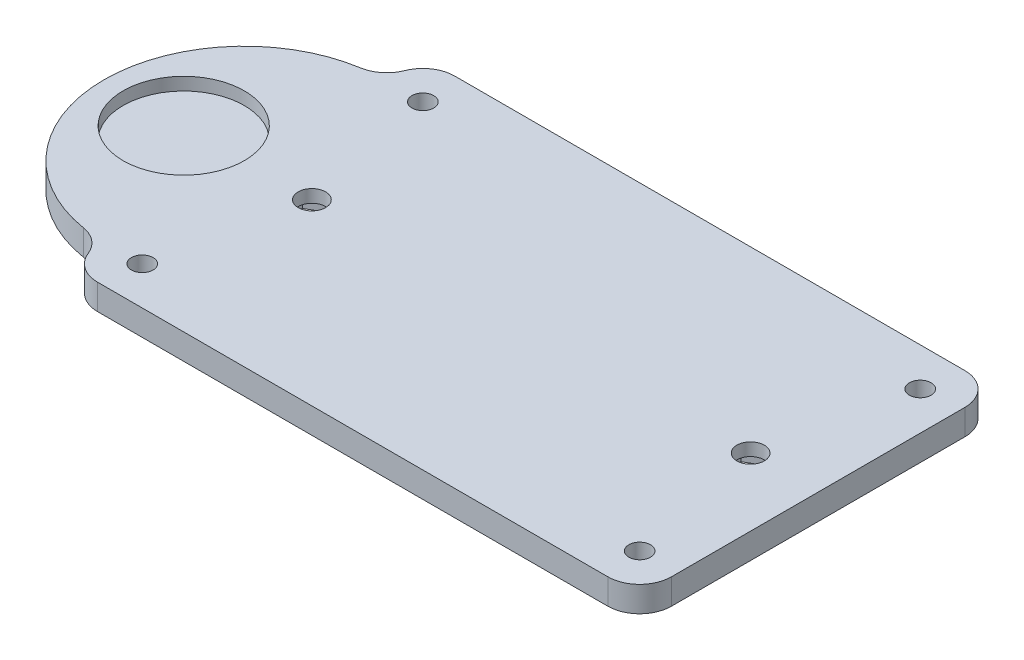
ISO-10303-21;
HEADER;
FILE_DESCRIPTION(('STEP AP214'),'2;1');
FILE_NAME('part.step','',(''),(''),'','','');
FILE_SCHEMA(('AUTOMOTIVE_DESIGN { 1 0 10303 214 1 1 1 1 }'));
ENDSEC;
DATA;
#1=APPLICATION_CONTEXT('core data for automotive mechanical design processes');
#2=APPLICATION_PROTOCOL_DEFINITION('international standard','automotive_design',2000,#1);
#3=PRODUCT_CONTEXT('',#1,'mechanical');
#4=PRODUCT('Part','Part','',(#3));
#5=PRODUCT_RELATED_PRODUCT_CATEGORY('part','',(#4));
#6=PRODUCT_DEFINITION_FORMATION('','',#4);
#7=PRODUCT_DEFINITION_CONTEXT('part definition',#1,'design');
#8=PRODUCT_DEFINITION('design','',#6,#7);
#9=PRODUCT_DEFINITION_SHAPE('','',#8);
#10=(LENGTH_UNIT() NAMED_UNIT(*) SI_UNIT(.MILLI.,.METRE.));
#11=(NAMED_UNIT(*) PLANE_ANGLE_UNIT() SI_UNIT($,.RADIAN.));
#12=(NAMED_UNIT(*) SI_UNIT($,.STERADIAN.) SOLID_ANGLE_UNIT());
#13=UNCERTAINTY_MEASURE_WITH_UNIT(LENGTH_MEASURE(1.E-05),#10,'distance_accuracy_value','');
#14=(GEOMETRIC_REPRESENTATION_CONTEXT(3) GLOBAL_UNCERTAINTY_ASSIGNED_CONTEXT((#13)) GLOBAL_UNIT_ASSIGNED_CONTEXT((#10,
#11,#12)) REPRESENTATION_CONTEXT('',''));
#15=CARTESIAN_POINT('',(0.,0.,0.));
#16=DIRECTION('',(0.,0.,1.));
#17=DIRECTION('',(1.,0.,0.));
#18=AXIS2_PLACEMENT_3D('',#15,#16,#17);
#19=CARTESIAN_POINT('',(-34.4,0.,0.));
#20=DIRECTION('',(0.,1.,0.));
#21=DIRECTION('',(0.,0.,1.));
#22=AXIS2_PLACEMENT_3D('',#19,#20,#21);
#23=CYLINDRICAL_SURFACE('',#22,2.15);
#24=CARTESIAN_POINT('',(-34.4,4.,0.));
#25=DIRECTION('',(0.,1.,0.));
#26=DIRECTION('',(0.,0.,1.));
#27=AXIS2_PLACEMENT_3D('',#24,#25,#26);
#28=CIRCLE('',#27,2.15);
#29=CARTESIAN_POINT('',(-34.4,4.,2.15));
#30=VERTEX_POINT('',#29);
#31=EDGE_CURVE('E349',#30,#30,#28,.T.);
#32=ORIENTED_EDGE('',*,*,#31,.T.);
#33=EDGE_LOOP('',(#32));
#34=FACE_BOUND('',#33,.T.);
#35=CARTESIAN_POINT('',(-34.4,2.,0.));
#36=DIRECTION('',(0.,-1.,0.));
#37=DIRECTION('',(0.,0.,-1.));
#38=AXIS2_PLACEMENT_3D('',#35,#36,#37);
#39=CIRCLE('',#38,2.15);
#40=CARTESIAN_POINT('',(-34.4,2.,-2.15));
#41=VERTEX_POINT('',#40);
#42=EDGE_CURVE('E344',#41,#41,#39,.F.);
#43=ORIENTED_EDGE('',*,*,#42,.F.);
#44=EDGE_LOOP('',(#43));
#45=FACE_BOUND('',#44,.T.);
#46=ADVANCED_FACE('F38',(#34,#45),#23,.F.);
#47=CARTESIAN_POINT('',(34.4,0.,0.));
#48=DIRECTION('',(0.,1.,0.));
#49=DIRECTION('',(0.,0.,1.));
#50=AXIS2_PLACEMENT_3D('',#47,#48,#49);
#51=CYLINDRICAL_SURFACE('',#50,2.15);
#52=CARTESIAN_POINT('',(34.4,4.,0.));
#53=DIRECTION('',(0.,1.,0.));
#54=DIRECTION('',(0.,0.,1.));
#55=AXIS2_PLACEMENT_3D('',#52,#53,#54);
#56=CIRCLE('',#55,2.15);
#57=CARTESIAN_POINT('',(34.4,4.,2.15));
#58=VERTEX_POINT('',#57);
#59=EDGE_CURVE('E345',#58,#58,#56,.T.);
#60=ORIENTED_EDGE('',*,*,#59,.T.);
#61=EDGE_LOOP('',(#60));
#62=FACE_BOUND('',#61,.T.);
#63=CARTESIAN_POINT('',(34.4,2.,0.));
#64=DIRECTION('',(0.,-1.,0.));
#65=DIRECTION('',(0.,0.,-1.));
#66=AXIS2_PLACEMENT_3D('',#63,#64,#65);
#67=CIRCLE('',#66,2.15);
#68=CARTESIAN_POINT('',(34.4,2.,-2.15));
#69=VERTEX_POINT('',#68);
#70=EDGE_CURVE('E257',#69,#69,#67,.F.);
#71=ORIENTED_EDGE('',*,*,#70,.F.);
#72=EDGE_LOOP('',(#71));
#73=FACE_BOUND('',#72,.T.);
#74=ADVANCED_FACE('F524',(#62,#73),#51,.F.);
#75=CARTESIAN_POINT('',(-45.,4.,28.));
#76=DIRECTION('',(0.,0.,-1.));
#77=DIRECTION('',(-1.,0.,0.));
#78=AXIS2_PLACEMENT_3D('',#75,#76,#77);
#79=PLANE('',#78);
#80=DIRECTION('',(1.,0.,0.));
#81=VECTOR('',#80,1.);
#82=CARTESIAN_POINT('',(-45.,0.,28.));
#83=LINE('',#82,#81);
#84=CARTESIAN_POINT('',(-40.,0.,28.));
#85=VERTEX_POINT('',#84);
#86=CARTESIAN_POINT('',(40.,0.,28.));
#87=VERTEX_POINT('',#86);
#88=EDGE_CURVE('E376',#85,#87,#83,.T.);
#89=ORIENTED_EDGE('',*,*,#88,.T.);
#90=DIRECTION('',(0.,-1.,0.));
#91=VECTOR('',#90,1.);
#92=CARTESIAN_POINT('',(40.,4.,28.));
#93=LINE('',#92,#91);
#94=CARTESIAN_POINT('',(40.,4.,28.));
#95=VERTEX_POINT('',#94);
#96=EDGE_CURVE('E430',#87,#95,#93,.F.);
#97=ORIENTED_EDGE('',*,*,#96,.T.);
#98=DIRECTION('',(1.,0.,0.));
#99=VECTOR('',#98,1.);
#100=CARTESIAN_POINT('',(-45.,4.,28.));
#101=LINE('',#100,#99);
#102=CARTESIAN_POINT('',(-40.,4.,28.));
#103=VERTEX_POINT('',#102);
#104=EDGE_CURVE('E377',#103,#95,#101,.T.);
#105=ORIENTED_EDGE('',*,*,#104,.F.);
#106=DIRECTION('',(0.,-1.,0.));
#107=VECTOR('',#106,1.);
#108=CARTESIAN_POINT('',(-40.,4.,28.));
#109=LINE('',#108,#107);
#110=EDGE_CURVE('E426',#103,#85,#109,.T.);
#111=ORIENTED_EDGE('',*,*,#110,.T.);
#112=EDGE_LOOP('',(#89,#97,#105,#111));
#113=FACE_BOUND('',#112,.T.);
#114=ADVANCED_FACE('F507',(#113),#79,.F.);
#115=CARTESIAN_POINT('',(45.,4.,-28.));
#116=DIRECTION('',(-1.,0.,0.));
#117=DIRECTION('',(0.,0.,1.));
#118=AXIS2_PLACEMENT_3D('',#115,#116,#117);
#119=PLANE('',#118);
#120=DIRECTION('',(0.,0.,-1.));
#121=VECTOR('',#120,1.);
#122=CARTESIAN_POINT('',(45.,4.,-28.));
#123=LINE('',#122,#121);
#124=CARTESIAN_POINT('',(45.,4.,23.));
#125=VERTEX_POINT('',#124);
#126=CARTESIAN_POINT('',(45.,4.,-23.));
#127=VERTEX_POINT('',#126);
#128=EDGE_CURVE('E381',#125,#127,#123,.T.);
#129=ORIENTED_EDGE('',*,*,#128,.F.);
#130=DIRECTION('',(0.,-1.,0.));
#131=VECTOR('',#130,1.);
#132=CARTESIAN_POINT('',(45.,4.,23.));
#133=LINE('',#132,#131);
#134=CARTESIAN_POINT('',(45.,0.,23.));
#135=VERTEX_POINT('',#134);
#136=EDGE_CURVE('E409',#125,#135,#133,.T.);
#137=ORIENTED_EDGE('',*,*,#136,.T.);
#138=DIRECTION('',(0.,0.,-1.));
#139=VECTOR('',#138,1.);
#140=CARTESIAN_POINT('',(45.,0.,-28.));
#141=LINE('',#140,#139);
#142=CARTESIAN_POINT('',(45.,0.,-23.));
#143=VERTEX_POINT('',#142);
#144=EDGE_CURVE('E394',#135,#143,#141,.T.);
#145=ORIENTED_EDGE('',*,*,#144,.T.);
#146=DIRECTION('',(0.,-1.,0.));
#147=VECTOR('',#146,1.);
#148=CARTESIAN_POINT('',(45.,4.,-23.));
#149=LINE('',#148,#147);
#150=EDGE_CURVE('E390',#143,#127,#149,.F.);
#151=ORIENTED_EDGE('',*,*,#150,.T.);
#152=EDGE_LOOP('',(#129,#137,#145,#151));
#153=FACE_BOUND('',#152,.T.);
#154=ADVANCED_FACE('F499',(#153),#119,.F.);
#155=CARTESIAN_POINT('',(-45.,4.,-28.));
#156=DIRECTION('',(0.,0.,1.));
#157=DIRECTION('',(1.,0.,0.));
#158=AXIS2_PLACEMENT_3D('',#155,#156,#157);
#159=PLANE('',#158);
#160=DIRECTION('',(-1.,0.,0.));
#161=VECTOR('',#160,1.);
#162=CARTESIAN_POINT('',(-45.,4.,-28.));
#163=LINE('',#162,#161);
#164=CARTESIAN_POINT('',(40.,4.,-28.));
#165=VERTEX_POINT('',#164);
#166=CARTESIAN_POINT('',(-40.,4.,-28.));
#167=VERTEX_POINT('',#166);
#168=EDGE_CURVE('E386',#165,#167,#163,.T.);
#169=ORIENTED_EDGE('',*,*,#168,.F.);
#170=DIRECTION('',(0.,-1.,0.));
#171=VECTOR('',#170,1.);
#172=CARTESIAN_POINT('',(40.,4.,-28.));
#173=LINE('',#172,#171);
#174=CARTESIAN_POINT('',(40.,0.,-28.));
#175=VERTEX_POINT('',#174);
#176=EDGE_CURVE('E449',#165,#175,#173,.T.);
#177=ORIENTED_EDGE('',*,*,#176,.T.);
#178=DIRECTION('',(-1.,0.,0.));
#179=VECTOR('',#178,1.);
#180=CARTESIAN_POINT('',(-45.,0.,-28.));
#181=LINE('',#180,#179);
#182=CARTESIAN_POINT('',(-40.,0.,-28.));
#183=VERTEX_POINT('',#182);
#184=EDGE_CURVE('E382',#175,#183,#181,.T.);
#185=ORIENTED_EDGE('',*,*,#184,.T.);
#186=DIRECTION('',(0.,-1.,0.));
#187=VECTOR('',#186,1.);
#188=CARTESIAN_POINT('',(-40.,4.,-28.));
#189=LINE('',#188,#187);
#190=EDGE_CURVE('E446',#183,#167,#189,.F.);
#191=ORIENTED_EDGE('',*,*,#190,.T.);
#192=EDGE_LOOP('',(#169,#177,#185,#191));
#193=FACE_BOUND('',#192,.T.);
#194=ADVANCED_FACE('F491',(#193),#159,.F.);
#195=CARTESIAN_POINT('',(0.,4.,0.));
#196=DIRECTION('',(0.,1.,0.));
#197=DIRECTION('',(0.,0.,1.));
#198=AXIS2_PLACEMENT_3D('',#195,#196,#197);
#199=PLANE('',#198);
#200=CARTESIAN_POINT('',(-54.5,4.,0.));
#201=DIRECTION('',(0.,1.,0.));
#202=DIRECTION('',(0.,0.,1.));
#203=AXIS2_PLACEMENT_3D('',#200,#201,#202);
#204=CIRCLE('',#203,9.5);
#205=CARTESIAN_POINT('',(-54.5,4.,9.5));
#206=VERTEX_POINT('',#205);
#207=EDGE_CURVE('E881',#206,#206,#204,.T.);
#208=ORIENTED_EDGE('',*,*,#207,.F.);
#209=EDGE_LOOP('',(#208));
#210=FACE_BOUND('',#209,.T.);
#211=ORIENTED_EDGE('',*,*,#59,.F.);
#212=EDGE_LOOP('',(#211));
#213=FACE_BOUND('',#212,.T.);
#214=CARTESIAN_POINT('',(-39.0022908585976,4.,22.));
#215=DIRECTION('',(0.,1.,0.));
#216=DIRECTION('',(0.,0.,1.));
#217=AXIS2_PLACEMENT_3D('',#214,#215,#216);
#218=CIRCLE('',#217,1.7);
#219=CARTESIAN_POINT('',(-39.0022908585976,4.,23.7));
#220=VERTEX_POINT('',#219);
#221=EDGE_CURVE('E354',#220,#220,#218,.T.);
#222=ORIENTED_EDGE('',*,*,#221,.F.);
#223=EDGE_LOOP('',(#222));
#224=FACE_BOUND('',#223,.T.);
#225=CARTESIAN_POINT('',(39.,4.,22.));
#226=DIRECTION('',(0.,1.,0.));
#227=DIRECTION('',(0.,0.,1.));
#228=AXIS2_PLACEMENT_3D('',#225,#226,#227);
#229=CIRCLE('',#228,1.7);
#230=CARTESIAN_POINT('',(39.,4.,23.7));
#231=VERTEX_POINT('',#230);
#232=EDGE_CURVE('E362',#231,#231,#229,.T.);
#233=ORIENTED_EDGE('',*,*,#232,.F.);
#234=EDGE_LOOP('',(#233));
#235=FACE_BOUND('',#234,.T.);
#236=CARTESIAN_POINT('',(39.,4.,-22.));
#237=DIRECTION('',(0.,1.,0.));
#238=DIRECTION('',(0.,0.,1.));
#239=AXIS2_PLACEMENT_3D('',#236,#237,#238);
#240=CIRCLE('',#239,1.7);
#241=CARTESIAN_POINT('',(39.,4.,-20.3));
#242=VERTEX_POINT('',#241);
#243=EDGE_CURVE('E339',#242,#242,#240,.T.);
#244=ORIENTED_EDGE('',*,*,#243,.F.);
#245=EDGE_LOOP('',(#244));
#246=FACE_BOUND('',#245,.T.);
#247=CARTESIAN_POINT('',(-39.,4.,-22.));
#248=DIRECTION('',(0.,1.,0.));
#249=DIRECTION('',(0.,0.,1.));
#250=AXIS2_PLACEMENT_3D('',#247,#248,#249);
#251=CIRCLE('',#250,1.7);
#252=CARTESIAN_POINT('',(-39.,4.,-20.3));
#253=VERTEX_POINT('',#252);
#254=EDGE_CURVE('E340',#253,#253,#251,.T.);
#255=ORIENTED_EDGE('',*,*,#254,.F.);
#256=EDGE_LOOP('',(#255));
#257=FACE_BOUND('',#256,.T.);
#258=ORIENTED_EDGE('',*,*,#31,.F.);
#259=EDGE_LOOP('',(#258));
#260=FACE_BOUND('',#259,.T.);
#261=ORIENTED_EDGE('',*,*,#104,.T.);
#262=CARTESIAN_POINT('',(40.,4.,23.));
#263=DIRECTION('',(0.,1.,0.));
#264=DIRECTION('',(0.,0.,1.));
#265=AXIS2_PLACEMENT_3D('',#262,#263,#264);
#266=CIRCLE('',#265,5.);
#267=EDGE_CURVE('E443',#95,#125,#266,.T.);
#268=ORIENTED_EDGE('',*,*,#267,.T.);
#269=ORIENTED_EDGE('',*,*,#128,.T.);
#270=CARTESIAN_POINT('',(40.,4.,-23.));
#271=DIRECTION('',(0.,1.,0.));
#272=DIRECTION('',(0.,0.,1.));
#273=AXIS2_PLACEMENT_3D('',#270,#271,#272);
#274=CIRCLE('',#273,5.);
#275=EDGE_CURVE('E440',#127,#165,#274,.T.);
#276=ORIENTED_EDGE('',*,*,#275,.T.);
#277=ORIENTED_EDGE('',*,*,#168,.T.);
#278=CARTESIAN_POINT('',(-40.,4.,-23.));
#279=DIRECTION('',(0.,1.,0.));
#280=DIRECTION('',(0.,0.,1.));
#281=AXIS2_PLACEMENT_3D('',#278,#279,#280);
#282=CIRCLE('',#281,5.);
#283=CARTESIAN_POINT('',(-44.6542488339916,4.,-24.8270106160851));
#284=VERTEX_POINT('',#283);
#285=EDGE_CURVE('E436',#167,#284,#282,.T.);
#286=ORIENTED_EDGE('',*,*,#285,.T.);
#287=CARTESIAN_POINT('',(-49.3084976679832,4.,-26.6540212321703));
#288=DIRECTION('',(0.,1.,0.));
#289=DIRECTION('',(0.,0.,1.));
#290=AXIS2_PLACEMENT_3D('',#287,#288,#289);
#291=CIRCLE('',#290,5.);
#292=CARTESIAN_POINT('',(-48.5106277294678,4.,-21.718091374361));
#293=VERTEX_POINT('',#292);
#294=EDGE_CURVE('E47',#284,#293,#291,.F.);
#295=ORIENTED_EDGE('',*,*,#294,.T.);
#296=CARTESIAN_POINT('',(-45.,4.,0.));
#297=DIRECTION('',(0.,1.,0.));
#298=DIRECTION('',(0.,0.,1.));
#299=AXIS2_PLACEMENT_3D('',#296,#297,#298);
#300=CIRCLE('',#299,22.);
#301=CARTESIAN_POINT('',(-48.5106277294678,4.,21.7180913743609));
#302=VERTEX_POINT('',#301);
#303=EDGE_CURVE('E223',#293,#302,#300,.T.);
#304=ORIENTED_EDGE('',*,*,#303,.T.);
#305=CARTESIAN_POINT('',(-49.3084976679832,4.,26.6540212321703));
#306=DIRECTION('',(0.,1.,0.));
#307=DIRECTION('',(0.,0.,1.));
#308=AXIS2_PLACEMENT_3D('',#305,#306,#307);
#309=CIRCLE('',#308,5.);
#310=CARTESIAN_POINT('',(-44.6542488339916,4.,24.8270106160851));
#311=VERTEX_POINT('',#310);
#312=EDGE_CURVE('E466',#302,#311,#309,.F.);
#313=ORIENTED_EDGE('',*,*,#312,.T.);
#314=CARTESIAN_POINT('',(-40.,4.,23.));
#315=DIRECTION('',(0.,1.,0.));
#316=DIRECTION('',(0.,0.,1.));
#317=AXIS2_PLACEMENT_3D('',#314,#315,#316);
#318=CIRCLE('',#317,5.);
#319=EDGE_CURVE('E433',#311,#103,#318,.T.);
#320=ORIENTED_EDGE('',*,*,#319,.T.);
#321=EDGE_LOOP('',(#261,#268,#269,#276,#277,#286,#295,#304,#313,#320));
#322=FACE_BOUND('',#321,.T.);
#323=ADVANCED_FACE('F475',(#210,#213,#224,#235,#246,#257,#260,#322),#199,.T.);
#324=CARTESIAN_POINT('',(0.,0.,0.));
#325=DIRECTION('',(0.,1.,0.));
#326=DIRECTION('',(0.,0.,1.));
#327=AXIS2_PLACEMENT_3D('',#324,#325,#326);
#328=PLANE('',#327);
#329=DIRECTION('',(0.866025403784439,0.,-0.5));
#330=VECTOR('',#329,1.);
#331=CARTESIAN_POINT('',(30.825,0.,-2.06402721235292));
#332=LINE('',#331,#330);
#333=CARTESIAN_POINT('',(30.825,0.,-2.06402721235292));
#334=VERTEX_POINT('',#333);
#335=CARTESIAN_POINT('',(34.4,0.,-4.12805442470583));
#336=VERTEX_POINT('',#335);
#337=EDGE_CURVE('E239',#334,#336,#332,.T.);
#338=ORIENTED_EDGE('',*,*,#337,.F.);
#339=DIRECTION('',(0.,0.,-1.));
#340=VECTOR('',#339,1.);
#341=CARTESIAN_POINT('',(30.825,0.,2.06402721235291));
#342=LINE('',#341,#340);
#343=CARTESIAN_POINT('',(30.825,0.,2.06402721235291));
#344=VERTEX_POINT('',#343);
#345=EDGE_CURVE('E194',#344,#334,#342,.T.);
#346=ORIENTED_EDGE('',*,*,#345,.F.);
#347=DIRECTION('',(-0.866025403784439,0.,-0.499999999999999));
#348=VECTOR('',#347,1.);
#349=CARTESIAN_POINT('',(34.4,0.,4.12805442470582));
#350=LINE('',#349,#348);
#351=CARTESIAN_POINT('',(34.4,0.,4.12805442470582));
#352=VERTEX_POINT('',#351);
#353=EDGE_CURVE('E216',#352,#344,#350,.T.);
#354=ORIENTED_EDGE('',*,*,#353,.F.);
#355=DIRECTION('',(-0.866025403784438,0.,0.500000000000001));
#356=VECTOR('',#355,1.);
#357=CARTESIAN_POINT('',(37.975,0.,2.0640272123529));
#358=LINE('',#357,#356);
#359=CARTESIAN_POINT('',(37.975,0.,2.0640272123529));
#360=VERTEX_POINT('',#359);
#361=EDGE_CURVE('E220',#360,#352,#358,.T.);
#362=ORIENTED_EDGE('',*,*,#361,.F.);
#363=DIRECTION('',(0.,0.,1.));
#364=VECTOR('',#363,1.);
#365=CARTESIAN_POINT('',(37.975,0.,-2.06402721235292));
#366=LINE('',#365,#364);
#367=CARTESIAN_POINT('',(37.975,0.,-2.06402721235292));
#368=VERTEX_POINT('',#367);
#369=EDGE_CURVE('E247',#368,#360,#366,.T.);
#370=ORIENTED_EDGE('',*,*,#369,.F.);
#371=DIRECTION('',(0.866025403784438,0.,0.5));
#372=VECTOR('',#371,1.);
#373=CARTESIAN_POINT('',(34.4,0.,-4.12805442470583));
#374=LINE('',#373,#372);
#375=EDGE_CURVE('E243',#336,#368,#374,.T.);
#376=ORIENTED_EDGE('',*,*,#375,.F.);
#377=EDGE_LOOP('',(#338,#346,#354,#362,#370,#376));
#378=FACE_BOUND('',#377,.T.);
#379=DIRECTION('',(0.866025403784438,0.,-0.5));
#380=VECTOR('',#379,1.);
#381=CARTESIAN_POINT('',(-37.975,0.,-2.06402721235292));
#382=LINE('',#381,#380);
#383=CARTESIAN_POINT('',(-37.975,0.,-2.06402721235292));
#384=VERTEX_POINT('',#383);
#385=CARTESIAN_POINT('',(-34.4,0.,-4.12805442470583));
#386=VERTEX_POINT('',#385);
#387=EDGE_CURVE('E298',#384,#386,#382,.T.);
#388=ORIENTED_EDGE('',*,*,#387,.F.);
#389=DIRECTION('',(0.,0.,-1.));
#390=VECTOR('',#389,1.);
#391=CARTESIAN_POINT('',(-37.975,0.,2.06402721235291));
#392=LINE('',#391,#390);
#393=CARTESIAN_POINT('',(-37.975,0.,2.06402721235291));
#394=VERTEX_POINT('',#393);
#395=EDGE_CURVE('E295',#394,#384,#392,.T.);
#396=ORIENTED_EDGE('',*,*,#395,.F.);
#397=DIRECTION('',(-0.866025403784439,0.,-0.5));
#398=VECTOR('',#397,1.);
#399=CARTESIAN_POINT('',(-34.4,0.,4.12805442470582));
#400=LINE('',#399,#398);
#401=CARTESIAN_POINT('',(-34.4,0.,4.12805442470582));
#402=VERTEX_POINT('',#401);
#403=EDGE_CURVE('E274',#402,#394,#400,.T.);
#404=ORIENTED_EDGE('',*,*,#403,.F.);
#405=DIRECTION('',(-0.866025403784439,0.,0.5));
#406=VECTOR('',#405,1.);
#407=CARTESIAN_POINT('',(-30.825,0.,2.06402721235291));
#408=LINE('',#407,#406);
#409=CARTESIAN_POINT('',(-30.825,0.,2.06402721235291));
#410=VERTEX_POINT('',#409);
#411=EDGE_CURVE('E311',#410,#402,#408,.T.);
#412=ORIENTED_EDGE('',*,*,#411,.F.);
#413=DIRECTION('',(0.,0.,1.));
#414=VECTOR('',#413,1.);
#415=CARTESIAN_POINT('',(-30.825,0.,-2.06402721235292));
#416=LINE('',#415,#414);
#417=CARTESIAN_POINT('',(-30.825,0.,-2.06402721235292));
#418=VERTEX_POINT('',#417);
#419=EDGE_CURVE('E307',#418,#410,#416,.T.);
#420=ORIENTED_EDGE('',*,*,#419,.F.);
#421=DIRECTION('',(0.866025403784439,0.,0.5));
#422=VECTOR('',#421,1.);
#423=CARTESIAN_POINT('',(-34.4,0.,-4.12805442470583));
#424=LINE('',#423,#422);
#425=EDGE_CURVE('E303',#386,#418,#424,.T.);
#426=ORIENTED_EDGE('',*,*,#425,.F.);
#427=EDGE_LOOP('',(#388,#396,#404,#412,#420,#426));
#428=FACE_BOUND('',#427,.T.);
#429=CARTESIAN_POINT('',(-39.0022908585976,0.,22.));
#430=DIRECTION('',(0.,1.,0.));
#431=DIRECTION('',(0.,0.,1.));
#432=AXIS2_PLACEMENT_3D('',#429,#430,#431);
#433=CIRCLE('',#432,1.7);
#434=CARTESIAN_POINT('',(-39.0022908585976,0.,23.7));
#435=VERTEX_POINT('',#434);
#436=EDGE_CURVE('E350',#435,#435,#433,.T.);
#437=ORIENTED_EDGE('',*,*,#436,.T.);
#438=EDGE_LOOP('',(#437));
#439=FACE_BOUND('',#438,.T.);
#440=CARTESIAN_POINT('',(39.,0.,22.));
#441=DIRECTION('',(0.,1.,0.));
#442=DIRECTION('',(0.,0.,1.));
#443=AXIS2_PLACEMENT_3D('',#440,#441,#442);
#444=CIRCLE('',#443,1.7);
#445=CARTESIAN_POINT('',(39.,0.,23.7));
#446=VERTEX_POINT('',#445);
#447=EDGE_CURVE('E358',#446,#446,#444,.T.);
#448=ORIENTED_EDGE('',*,*,#447,.T.);
#449=EDGE_LOOP('',(#448));
#450=FACE_BOUND('',#449,.T.);
#451=CARTESIAN_POINT('',(39.,0.,-22.));
#452=DIRECTION('',(0.,1.,0.));
#453=DIRECTION('',(0.,0.,1.));
#454=AXIS2_PLACEMENT_3D('',#451,#452,#453);
#455=CIRCLE('',#454,1.7);
#456=CARTESIAN_POINT('',(39.,0.,-20.3));
#457=VERTEX_POINT('',#456);
#458=EDGE_CURVE('E366',#457,#457,#455,.T.);
#459=ORIENTED_EDGE('',*,*,#458,.T.);
#460=EDGE_LOOP('',(#459));
#461=FACE_BOUND('',#460,.T.);
#462=CARTESIAN_POINT('',(-39.,0.,-22.));
#463=DIRECTION('',(0.,1.,0.));
#464=DIRECTION('',(0.,0.,1.));
#465=AXIS2_PLACEMENT_3D('',#462,#463,#464);
#466=CIRCLE('',#465,1.7);
#467=CARTESIAN_POINT('',(-39.,0.,-20.3));
#468=VERTEX_POINT('',#467);
#469=EDGE_CURVE('E335',#468,#468,#466,.T.);
#470=ORIENTED_EDGE('',*,*,#469,.T.);
#471=EDGE_LOOP('',(#470));
#472=FACE_BOUND('',#471,.T.);
#473=ORIENTED_EDGE('',*,*,#144,.F.);
#474=CARTESIAN_POINT('',(40.,0.,23.));
#475=DIRECTION('',(0.,1.,0.));
#476=DIRECTION('',(0.,0.,1.));
#477=AXIS2_PLACEMENT_3D('',#474,#475,#476);
#478=CIRCLE('',#477,5.);
#479=EDGE_CURVE('E423',#135,#87,#478,.F.);
#480=ORIENTED_EDGE('',*,*,#479,.T.);
#481=ORIENTED_EDGE('',*,*,#88,.F.);
#482=CARTESIAN_POINT('',(-40.,0.,23.));
#483=DIRECTION('',(0.,1.,0.));
#484=DIRECTION('',(0.,0.,1.));
#485=AXIS2_PLACEMENT_3D('',#482,#483,#484);
#486=CIRCLE('',#485,5.);
#487=CARTESIAN_POINT('',(-44.6542488339916,0.,24.8270106160851));
#488=VERTEX_POINT('',#487);
#489=EDGE_CURVE('E413',#85,#488,#486,.F.);
#490=ORIENTED_EDGE('',*,*,#489,.T.);
#491=CARTESIAN_POINT('',(-49.3084976679832,0.,26.6540212321703));
#492=DIRECTION('',(0.,1.,0.));
#493=DIRECTION('',(0.,0.,1.));
#494=AXIS2_PLACEMENT_3D('',#491,#492,#493);
#495=CIRCLE('',#494,5.);
#496=CARTESIAN_POINT('',(-48.5106277294678,0.,21.7180913743609));
#497=VERTEX_POINT('',#496);
#498=EDGE_CURVE('E469',#488,#497,#495,.T.);
#499=ORIENTED_EDGE('',*,*,#498,.T.);
#500=CARTESIAN_POINT('',(-45.,0.,0.));
#501=DIRECTION('',(0.,1.,0.));
#502=DIRECTION('',(0.,0.,1.));
#503=AXIS2_PLACEMENT_3D('',#500,#501,#502);
#504=CIRCLE('',#503,22.);
#505=CARTESIAN_POINT('',(-48.5106277294678,0.,-21.718091374361));
#506=VERTEX_POINT('',#505);
#507=EDGE_CURVE('E299',#506,#497,#504,.T.);
#508=ORIENTED_EDGE('',*,*,#507,.F.);
#509=CARTESIAN_POINT('',(-49.3084976679832,0.,-26.6540212321703));
#510=DIRECTION('',(0.,1.,0.));
#511=DIRECTION('',(0.,0.,1.));
#512=AXIS2_PLACEMENT_3D('',#509,#510,#511);
#513=CIRCLE('',#512,5.);
#514=CARTESIAN_POINT('',(-44.6542488339916,0.,-24.8270106160851));
#515=VERTEX_POINT('',#514);
#516=EDGE_CURVE('E11',#506,#515,#513,.T.);
#517=ORIENTED_EDGE('',*,*,#516,.T.);
#518=CARTESIAN_POINT('',(-40.,0.,-23.));
#519=DIRECTION('',(0.,1.,0.));
#520=DIRECTION('',(0.,0.,1.));
#521=AXIS2_PLACEMENT_3D('',#518,#519,#520);
#522=CIRCLE('',#521,5.);
#523=EDGE_CURVE('E417',#515,#183,#522,.F.);
#524=ORIENTED_EDGE('',*,*,#523,.T.);
#525=ORIENTED_EDGE('',*,*,#184,.F.);
#526=CARTESIAN_POINT('',(40.,0.,-23.));
#527=DIRECTION('',(0.,1.,0.));
#528=DIRECTION('',(0.,0.,1.));
#529=AXIS2_PLACEMENT_3D('',#526,#527,#528);
#530=CIRCLE('',#529,5.);
#531=EDGE_CURVE('E420',#175,#143,#530,.F.);
#532=ORIENTED_EDGE('',*,*,#531,.T.);
#533=EDGE_LOOP('',(#473,#480,#481,#490,#499,#508,#517,#524,#525,#532));
#534=FACE_BOUND('',#533,.T.);
#535=ADVANCED_FACE('F488',(#378,#428,#439,#450,#461,#472,#534),#328,.F.);
#536=CARTESIAN_POINT('',(-39.,0.,-22.));
#537=DIRECTION('',(0.,1.,0.));
#538=DIRECTION('',(0.,0.,1.));
#539=AXIS2_PLACEMENT_3D('',#536,#537,#538);
#540=CYLINDRICAL_SURFACE('',#539,1.7);
#541=ORIENTED_EDGE('',*,*,#469,.F.);
#542=EDGE_LOOP('',(#541));
#543=FACE_BOUND('',#542,.T.);
#544=ORIENTED_EDGE('',*,*,#254,.T.);
#545=EDGE_LOOP('',(#544));
#546=FACE_BOUND('',#545,.T.);
#547=ADVANCED_FACE('F542',(#543,#546),#540,.F.);
#548=CARTESIAN_POINT('',(39.,0.,-22.));
#549=DIRECTION('',(0.,1.,0.));
#550=DIRECTION('',(0.,0.,1.));
#551=AXIS2_PLACEMENT_3D('',#548,#549,#550);
#552=CYLINDRICAL_SURFACE('',#551,1.7);
#553=ORIENTED_EDGE('',*,*,#458,.F.);
#554=EDGE_LOOP('',(#553));
#555=FACE_BOUND('',#554,.T.);
#556=ORIENTED_EDGE('',*,*,#243,.T.);
#557=EDGE_LOOP('',(#556));
#558=FACE_BOUND('',#557,.T.);
#559=ADVANCED_FACE('F535',(#555,#558),#552,.F.);
#560=CARTESIAN_POINT('',(39.,0.,22.));
#561=DIRECTION('',(0.,1.,0.));
#562=DIRECTION('',(0.,0.,1.));
#563=AXIS2_PLACEMENT_3D('',#560,#561,#562);
#564=CYLINDRICAL_SURFACE('',#563,1.7);
#565=ORIENTED_EDGE('',*,*,#447,.F.);
#566=EDGE_LOOP('',(#565));
#567=FACE_BOUND('',#566,.T.);
#568=ORIENTED_EDGE('',*,*,#232,.T.);
#569=EDGE_LOOP('',(#568));
#570=FACE_BOUND('',#569,.T.);
#571=ADVANCED_FACE('F769',(#567,#570),#564,.F.);
#572=CARTESIAN_POINT('',(-39.0022908585976,0.,22.));
#573=DIRECTION('',(0.,1.,0.));
#574=DIRECTION('',(0.,0.,1.));
#575=AXIS2_PLACEMENT_3D('',#572,#573,#574);
#576=CYLINDRICAL_SURFACE('',#575,1.7);
#577=ORIENTED_EDGE('',*,*,#436,.F.);
#578=EDGE_LOOP('',(#577));
#579=FACE_BOUND('',#578,.T.);
#580=ORIENTED_EDGE('',*,*,#221,.T.);
#581=EDGE_LOOP('',(#580));
#582=FACE_BOUND('',#581,.T.);
#583=ADVANCED_FACE('F752',(#579,#582),#576,.F.);
#584=CARTESIAN_POINT('',(0.,2.,0.));
#585=DIRECTION('',(0.,-1.,0.));
#586=DIRECTION('',(0.,0.,-1.));
#587=AXIS2_PLACEMENT_3D('',#584,#585,#586);
#588=PLANE('',#587);
#589=DIRECTION('',(0.,0.,-1.));
#590=VECTOR('',#589,1.);
#591=CARTESIAN_POINT('',(30.825,2.,2.06402721235291));
#592=LINE('',#591,#590);
#593=CARTESIAN_POINT('',(30.825,2.,2.06402721235291));
#594=VERTEX_POINT('',#593);
#595=CARTESIAN_POINT('',(30.825,2.,-2.06402721235292));
#596=VERTEX_POINT('',#595);
#597=EDGE_CURVE('E191',#594,#596,#592,.T.);
#598=ORIENTED_EDGE('',*,*,#597,.T.);
#599=DIRECTION('',(0.866025403784439,0.,-0.5));
#600=VECTOR('',#599,1.);
#601=CARTESIAN_POINT('',(30.825,2.,-2.06402721235292));
#602=LINE('',#601,#600);
#603=CARTESIAN_POINT('',(34.4,2.,-4.12805442470583));
#604=VERTEX_POINT('',#603);
#605=EDGE_CURVE('E203',#596,#604,#602,.T.);
#606=ORIENTED_EDGE('',*,*,#605,.T.);
#607=DIRECTION('',(0.866025403784438,0.,0.5));
#608=VECTOR('',#607,1.);
#609=CARTESIAN_POINT('',(34.4,2.,-4.12805442470583));
#610=LINE('',#609,#608);
#611=CARTESIAN_POINT('',(37.975,2.,-2.06402721235292));
#612=VERTEX_POINT('',#611);
#613=EDGE_CURVE('E209',#604,#612,#610,.T.);
#614=ORIENTED_EDGE('',*,*,#613,.T.);
#615=DIRECTION('',(0.,0.,1.));
#616=VECTOR('',#615,1.);
#617=CARTESIAN_POINT('',(37.975,2.,-2.06402721235292));
#618=LINE('',#617,#616);
#619=CARTESIAN_POINT('',(37.975,2.,2.0640272123529));
#620=VERTEX_POINT('',#619);
#621=EDGE_CURVE('E228',#612,#620,#618,.T.);
#622=ORIENTED_EDGE('',*,*,#621,.T.);
#623=DIRECTION('',(-0.866025403784438,0.,0.500000000000001));
#624=VECTOR('',#623,1.);
#625=CARTESIAN_POINT('',(37.975,2.,2.0640272123529));
#626=LINE('',#625,#624);
#627=CARTESIAN_POINT('',(34.4,2.,4.12805442470582));
#628=VERTEX_POINT('',#627);
#629=EDGE_CURVE('E232',#620,#628,#626,.T.);
#630=ORIENTED_EDGE('',*,*,#629,.T.);
#631=DIRECTION('',(-0.866025403784439,0.,-0.499999999999999));
#632=VECTOR('',#631,1.);
#633=CARTESIAN_POINT('',(34.4,2.,4.12805442470582));
#634=LINE('',#633,#632);
#635=EDGE_CURVE('E200',#628,#594,#634,.T.);
#636=ORIENTED_EDGE('',*,*,#635,.T.);
#637=EDGE_LOOP('',(#598,#606,#614,#622,#630,#636));
#638=FACE_BOUND('',#637,.T.);
#639=ORIENTED_EDGE('',*,*,#70,.T.);
#640=EDGE_LOOP('',(#639));
#641=FACE_BOUND('',#640,.T.);
#642=ADVANCED_FACE('F211',(#638,#641),#588,.T.);
#643=CARTESIAN_POINT('',(30.825,2.,2.06402721235291));
#644=DIRECTION('',(-1.,0.,0.));
#645=DIRECTION('',(0.,0.,1.));
#646=AXIS2_PLACEMENT_3D('',#643,#644,#645);
#647=PLANE('',#646);
#648=ORIENTED_EDGE('',*,*,#345,.T.);
#649=DIRECTION('',(0.,-1.,0.));
#650=VECTOR('',#649,1.);
#651=CARTESIAN_POINT('',(30.825,2.,-2.06402721235292));
#652=LINE('',#651,#650);
#653=EDGE_CURVE('E187',#596,#334,#652,.T.);
#654=ORIENTED_EDGE('',*,*,#653,.F.);
#655=ORIENTED_EDGE('',*,*,#597,.F.);
#656=DIRECTION('',(0.,-1.,0.));
#657=VECTOR('',#656,1.);
#658=CARTESIAN_POINT('',(30.825,2.,2.06402721235291));
#659=LINE('',#658,#657);
#660=EDGE_CURVE('E254',#594,#344,#659,.T.);
#661=ORIENTED_EDGE('',*,*,#660,.T.);
#662=EDGE_LOOP('',(#648,#654,#655,#661));
#663=FACE_BOUND('',#662,.T.);
#664=ADVANCED_FACE('F189',(#663),#647,.F.);
#665=CARTESIAN_POINT('',(34.4,2.,4.12805442470582));
#666=DIRECTION('',(-0.499999999999999,0.,0.866025403784439));
#667=DIRECTION('',(0.866025403784439,0.,0.499999999999999));
#668=AXIS2_PLACEMENT_3D('',#665,#666,#667);
#669=PLANE('',#668);
#670=ORIENTED_EDGE('',*,*,#353,.T.);
#671=ORIENTED_EDGE('',*,*,#660,.F.);
#672=ORIENTED_EDGE('',*,*,#635,.F.);
#673=DIRECTION('',(0.,-1.,0.));
#674=VECTOR('',#673,1.);
#675=CARTESIAN_POINT('',(34.4,2.,4.12805442470582));
#676=LINE('',#675,#674);
#677=EDGE_CURVE('E258',#628,#352,#676,.T.);
#678=ORIENTED_EDGE('',*,*,#677,.T.);
#679=EDGE_LOOP('',(#670,#671,#672,#678));
#680=FACE_BOUND('',#679,.T.);
#681=ADVANCED_FACE('F728',(#680),#669,.F.);
#682=CARTESIAN_POINT('',(37.975,2.,2.0640272123529));
#683=DIRECTION('',(0.500000000000001,0.,0.866025403784438));
#684=DIRECTION('',(0.866025403784438,0.,-0.500000000000001));
#685=AXIS2_PLACEMENT_3D('',#682,#683,#684);
#686=PLANE('',#685);
#687=ORIENTED_EDGE('',*,*,#361,.T.);
#688=ORIENTED_EDGE('',*,*,#677,.F.);
#689=ORIENTED_EDGE('',*,*,#629,.F.);
#690=DIRECTION('',(0.,-1.,0.));
#691=VECTOR('',#690,1.);
#692=CARTESIAN_POINT('',(37.975,2.,2.0640272123529));
#693=LINE('',#692,#691);
#694=EDGE_CURVE('E261',#620,#360,#693,.T.);
#695=ORIENTED_EDGE('',*,*,#694,.T.);
#696=EDGE_LOOP('',(#687,#688,#689,#695));
#697=FACE_BOUND('',#696,.T.);
#698=ADVANCED_FACE('F719',(#697),#686,.F.);
#699=CARTESIAN_POINT('',(37.975,2.,-2.06402721235292));
#700=DIRECTION('',(1.,0.,0.));
#701=DIRECTION('',(0.,0.,-1.));
#702=AXIS2_PLACEMENT_3D('',#699,#700,#701);
#703=PLANE('',#702);
#704=ORIENTED_EDGE('',*,*,#369,.T.);
#705=ORIENTED_EDGE('',*,*,#694,.F.);
#706=ORIENTED_EDGE('',*,*,#621,.F.);
#707=DIRECTION('',(0.,-1.,0.));
#708=VECTOR('',#707,1.);
#709=CARTESIAN_POINT('',(37.975,2.,-2.06402721235292));
#710=LINE('',#709,#708);
#711=EDGE_CURVE('E264',#612,#368,#710,.T.);
#712=ORIENTED_EDGE('',*,*,#711,.T.);
#713=EDGE_LOOP('',(#704,#705,#706,#712));
#714=FACE_BOUND('',#713,.T.);
#715=ADVANCED_FACE('F710',(#714),#703,.F.);
#716=CARTESIAN_POINT('',(34.4,2.,-4.12805442470583));
#717=DIRECTION('',(0.5,0.,-0.866025403784438));
#718=DIRECTION('',(-0.866025403784439,0.,-0.5));
#719=AXIS2_PLACEMENT_3D('',#716,#717,#718);
#720=PLANE('',#719);
#721=ORIENTED_EDGE('',*,*,#375,.T.);
#722=ORIENTED_EDGE('',*,*,#711,.F.);
#723=ORIENTED_EDGE('',*,*,#613,.F.);
#724=DIRECTION('',(0.,-1.,0.));
#725=VECTOR('',#724,1.);
#726=CARTESIAN_POINT('',(34.4,2.,-4.12805442470583));
#727=LINE('',#726,#725);
#728=EDGE_CURVE('E199',#604,#336,#727,.T.);
#729=ORIENTED_EDGE('',*,*,#728,.T.);
#730=EDGE_LOOP('',(#721,#722,#723,#729));
#731=FACE_BOUND('',#730,.T.);
#732=ADVANCED_FACE('F702',(#731),#720,.F.);
#733=CARTESIAN_POINT('',(30.825,2.,-2.06402721235292));
#734=DIRECTION('',(-0.5,0.,-0.866025403784439));
#735=DIRECTION('',(-0.866025403784439,0.,0.5));
#736=AXIS2_PLACEMENT_3D('',#733,#734,#735);
#737=PLANE('',#736);
#738=ORIENTED_EDGE('',*,*,#337,.T.);
#739=ORIENTED_EDGE('',*,*,#728,.F.);
#740=ORIENTED_EDGE('',*,*,#605,.F.);
#741=ORIENTED_EDGE('',*,*,#653,.T.);
#742=EDGE_LOOP('',(#738,#739,#740,#741));
#743=FACE_BOUND('',#742,.T.);
#744=ADVANCED_FACE('F204',(#743),#737,.F.);
#745=CARTESIAN_POINT('',(0.,2.,0.));
#746=DIRECTION('',(0.,-1.,0.));
#747=DIRECTION('',(0.,0.,-1.));
#748=AXIS2_PLACEMENT_3D('',#745,#746,#747);
#749=PLANE('',#748);
#750=DIRECTION('',(0.,0.,-1.));
#751=VECTOR('',#750,1.);
#752=CARTESIAN_POINT('',(-37.975,2.,2.06402721235291));
#753=LINE('',#752,#751);
#754=CARTESIAN_POINT('',(-37.975,2.,2.06402721235291));
#755=VERTEX_POINT('',#754);
#756=CARTESIAN_POINT('',(-37.975,2.,-2.06402721235292));
#757=VERTEX_POINT('',#756);
#758=EDGE_CURVE('E269',#755,#757,#753,.T.);
#759=ORIENTED_EDGE('',*,*,#758,.T.);
#760=DIRECTION('',(0.866025403784438,0.,-0.5));
#761=VECTOR('',#760,1.);
#762=CARTESIAN_POINT('',(-37.975,2.,-2.06402721235292));
#763=LINE('',#762,#761);
#764=CARTESIAN_POINT('',(-34.4,2.,-4.12805442470583));
#765=VERTEX_POINT('',#764);
#766=EDGE_CURVE('E273',#757,#765,#763,.T.);
#767=ORIENTED_EDGE('',*,*,#766,.T.);
#768=DIRECTION('',(0.866025403784439,0.,0.5));
#769=VECTOR('',#768,1.);
#770=CARTESIAN_POINT('',(-34.4,2.,-4.12805442470583));
#771=LINE('',#770,#769);
#772=CARTESIAN_POINT('',(-30.825,2.,-2.06402721235292));
#773=VERTEX_POINT('',#772);
#774=EDGE_CURVE('E278',#765,#773,#771,.T.);
#775=ORIENTED_EDGE('',*,*,#774,.T.);
#776=DIRECTION('',(0.,0.,1.));
#777=VECTOR('',#776,1.);
#778=CARTESIAN_POINT('',(-30.825,2.,-2.06402721235292));
#779=LINE('',#778,#777);
#780=CARTESIAN_POINT('',(-30.825,2.,2.06402721235291));
#781=VERTEX_POINT('',#780);
#782=EDGE_CURVE('E282',#773,#781,#779,.T.);
#783=ORIENTED_EDGE('',*,*,#782,.T.);
#784=DIRECTION('',(-0.866025403784439,0.,0.5));
#785=VECTOR('',#784,1.);
#786=CARTESIAN_POINT('',(-30.825,2.,2.06402721235291));
#787=LINE('',#786,#785);
#788=CARTESIAN_POINT('',(-34.4,2.,4.12805442470582));
#789=VERTEX_POINT('',#788);
#790=EDGE_CURVE('E286',#781,#789,#787,.T.);
#791=ORIENTED_EDGE('',*,*,#790,.T.);
#792=DIRECTION('',(-0.866025403784439,0.,-0.5));
#793=VECTOR('',#792,1.);
#794=CARTESIAN_POINT('',(-34.4,2.,4.12805442470582));
#795=LINE('',#794,#793);
#796=EDGE_CURVE('E290',#789,#755,#795,.T.);
#797=ORIENTED_EDGE('',*,*,#796,.T.);
#798=EDGE_LOOP('',(#759,#767,#775,#783,#791,#797));
#799=FACE_BOUND('',#798,.T.);
#800=ORIENTED_EDGE('',*,*,#42,.T.);
#801=EDGE_LOOP('',(#800));
#802=FACE_BOUND('',#801,.T.);
#803=ADVANCED_FACE('F685',(#799,#802),#749,.T.);
#804=CARTESIAN_POINT('',(-37.975,2.,2.06402721235291));
#805=DIRECTION('',(-1.,0.,0.));
#806=DIRECTION('',(0.,0.,1.));
#807=AXIS2_PLACEMENT_3D('',#804,#805,#806);
#808=PLANE('',#807);
#809=ORIENTED_EDGE('',*,*,#395,.T.);
#810=DIRECTION('',(0.,-1.,0.));
#811=VECTOR('',#810,1.);
#812=CARTESIAN_POINT('',(-37.975,2.,-2.06402721235292));
#813=LINE('',#812,#811);
#814=EDGE_CURVE('E294',#757,#384,#813,.T.);
#815=ORIENTED_EDGE('',*,*,#814,.F.);
#816=ORIENTED_EDGE('',*,*,#758,.F.);
#817=DIRECTION('',(0.,-1.,0.));
#818=VECTOR('',#817,1.);
#819=CARTESIAN_POINT('',(-37.975,2.,2.06402721235291));
#820=LINE('',#819,#818);
#821=EDGE_CURVE('E240',#755,#394,#820,.T.);
#822=ORIENTED_EDGE('',*,*,#821,.T.);
#823=EDGE_LOOP('',(#809,#815,#816,#822));
#824=FACE_BOUND('',#823,.T.);
#825=ADVANCED_FACE('F676',(#824),#808,.F.);
#826=CARTESIAN_POINT('',(-34.4,2.,4.12805442470582));
#827=DIRECTION('',(-0.5,0.,0.866025403784439));
#828=DIRECTION('',(0.866025403784439,0.,0.5));
#829=AXIS2_PLACEMENT_3D('',#826,#827,#828);
#830=PLANE('',#829);
#831=ORIENTED_EDGE('',*,*,#403,.T.);
#832=ORIENTED_EDGE('',*,*,#821,.F.);
#833=ORIENTED_EDGE('',*,*,#796,.F.);
#834=DIRECTION('',(0.,-1.,0.));
#835=VECTOR('',#834,1.);
#836=CARTESIAN_POINT('',(-34.4,2.,4.12805442470582));
#837=LINE('',#836,#835);
#838=EDGE_CURVE('E320',#789,#402,#837,.T.);
#839=ORIENTED_EDGE('',*,*,#838,.T.);
#840=EDGE_LOOP('',(#831,#832,#833,#839));
#841=FACE_BOUND('',#840,.T.);
#842=ADVANCED_FACE('F667',(#841),#830,.F.);
#843=CARTESIAN_POINT('',(-30.825,2.,2.06402721235291));
#844=DIRECTION('',(0.5,0.,0.866025403784439));
#845=DIRECTION('',(0.866025403784439,0.,-0.5));
#846=AXIS2_PLACEMENT_3D('',#843,#844,#845);
#847=PLANE('',#846);
#848=ORIENTED_EDGE('',*,*,#411,.T.);
#849=ORIENTED_EDGE('',*,*,#838,.F.);
#850=ORIENTED_EDGE('',*,*,#790,.F.);
#851=DIRECTION('',(0.,-1.,0.));
#852=VECTOR('',#851,1.);
#853=CARTESIAN_POINT('',(-30.825,2.,2.06402721235291));
#854=LINE('',#853,#852);
#855=EDGE_CURVE('E323',#781,#410,#854,.T.);
#856=ORIENTED_EDGE('',*,*,#855,.T.);
#857=EDGE_LOOP('',(#848,#849,#850,#856));
#858=FACE_BOUND('',#857,.T.);
#859=ADVANCED_FACE('F658',(#858),#847,.F.);
#860=CARTESIAN_POINT('',(-30.825,2.,-2.06402721235292));
#861=DIRECTION('',(1.,0.,0.));
#862=DIRECTION('',(0.,0.,-1.));
#863=AXIS2_PLACEMENT_3D('',#860,#861,#862);
#864=PLANE('',#863);
#865=ORIENTED_EDGE('',*,*,#419,.T.);
#866=ORIENTED_EDGE('',*,*,#855,.F.);
#867=ORIENTED_EDGE('',*,*,#782,.F.);
#868=DIRECTION('',(0.,-1.,0.));
#869=VECTOR('',#868,1.);
#870=CARTESIAN_POINT('',(-30.825,2.,-2.06402721235292));
#871=LINE('',#870,#869);
#872=EDGE_CURVE('E326',#773,#418,#871,.T.);
#873=ORIENTED_EDGE('',*,*,#872,.T.);
#874=EDGE_LOOP('',(#865,#866,#867,#873));
#875=FACE_BOUND('',#874,.T.);
#876=ADVANCED_FACE('F649',(#875),#864,.F.);
#877=CARTESIAN_POINT('',(-34.4,2.,-4.12805442470583));
#878=DIRECTION('',(0.5,0.,-0.866025403784439));
#879=DIRECTION('',(-0.866025403784439,0.,-0.5));
#880=AXIS2_PLACEMENT_3D('',#877,#878,#879);
#881=PLANE('',#880);
#882=ORIENTED_EDGE('',*,*,#425,.T.);
#883=ORIENTED_EDGE('',*,*,#872,.F.);
#884=ORIENTED_EDGE('',*,*,#774,.F.);
#885=DIRECTION('',(0.,-1.,0.));
#886=VECTOR('',#885,1.);
#887=CARTESIAN_POINT('',(-34.4,2.,-4.12805442470583));
#888=LINE('',#887,#886);
#889=EDGE_CURVE('E329',#765,#386,#888,.T.);
#890=ORIENTED_EDGE('',*,*,#889,.T.);
#891=EDGE_LOOP('',(#882,#883,#884,#890));
#892=FACE_BOUND('',#891,.T.);
#893=ADVANCED_FACE('F640',(#892),#881,.F.);
#894=CARTESIAN_POINT('',(-37.975,2.,-2.06402721235292));
#895=DIRECTION('',(-0.5,0.,-0.866025403784439));
#896=DIRECTION('',(-0.866025403784439,0.,0.5));
#897=AXIS2_PLACEMENT_3D('',#894,#895,#896);
#898=PLANE('',#897);
#899=ORIENTED_EDGE('',*,*,#387,.T.);
#900=ORIENTED_EDGE('',*,*,#889,.F.);
#901=ORIENTED_EDGE('',*,*,#766,.F.);
#902=ORIENTED_EDGE('',*,*,#814,.T.);
#903=EDGE_LOOP('',(#899,#900,#901,#902));
#904=FACE_BOUND('',#903,.T.);
#905=ADVANCED_FACE('F613',(#904),#898,.F.);
#906=CARTESIAN_POINT('',(-45.,0.,0.));
#907=DIRECTION('',(0.,1.,0.));
#908=DIRECTION('',(0.,0.,1.));
#909=AXIS2_PLACEMENT_3D('',#906,#907,#908);
#910=CYLINDRICAL_SURFACE('',#909,22.);
#911=ORIENTED_EDGE('',*,*,#507,.T.);
#912=DIRECTION('',(0.,1.,0.));
#913=VECTOR('',#912,1.);
#914=CARTESIAN_POINT('',(-48.5106277294678,0.,21.7180913743609));
#915=LINE('',#914,#913);
#916=EDGE_CURVE('E456',#497,#302,#915,.T.);
#917=ORIENTED_EDGE('',*,*,#916,.T.);
#918=ORIENTED_EDGE('',*,*,#303,.F.);
#919=DIRECTION('',(0.,1.,0.));
#920=VECTOR('',#919,1.);
#921=CARTESIAN_POINT('',(-48.5106277294678,0.,-21.718091374361));
#922=LINE('',#921,#920);
#923=EDGE_CURVE('E453',#293,#506,#922,.F.);
#924=ORIENTED_EDGE('',*,*,#923,.T.);
#925=EDGE_LOOP('',(#911,#917,#918,#924));
#926=FACE_BOUND('',#925,.T.);
#927=ADVANCED_FACE('F479',(#926),#910,.T.);
#928=CARTESIAN_POINT('',(-54.5,2.,0.));
#929=DIRECTION('',(0.,1.,0.));
#930=DIRECTION('',(0.,0.,1.));
#931=AXIS2_PLACEMENT_3D('',#928,#929,#930);
#932=CYLINDRICAL_SURFACE('',#931,9.5);
#933=CARTESIAN_POINT('',(-54.5,2.,0.));
#934=DIRECTION('',(0.,1.,0.));
#935=DIRECTION('',(0.,0.,1.));
#936=AXIS2_PLACEMENT_3D('',#933,#934,#935);
#937=CIRCLE('',#936,9.5);
#938=CARTESIAN_POINT('',(-54.5,2.,9.5));
#939=VERTEX_POINT('',#938);
#940=EDGE_CURVE('E482',#939,#939,#937,.T.);
#941=ORIENTED_EDGE('',*,*,#940,.F.);
#942=EDGE_LOOP('',(#941));
#943=FACE_BOUND('',#942,.T.);
#944=ORIENTED_EDGE('',*,*,#207,.T.);
#945=EDGE_LOOP('',(#944));
#946=FACE_BOUND('',#945,.T.);
#947=ADVANCED_FACE('F596',(#943,#946),#932,.F.);
#948=CARTESIAN_POINT('',(-54.5,2.,0.));
#949=DIRECTION('',(0.,1.,0.));
#950=DIRECTION('',(0.,0.,1.));
#951=AXIS2_PLACEMENT_3D('',#948,#949,#950);
#952=PLANE('',#951);
#953=ORIENTED_EDGE('',*,*,#940,.T.);
#954=EDGE_LOOP('',(#953));
#955=FACE_BOUND('',#954,.T.);
#956=ADVANCED_FACE('F552',(#955),#952,.T.);
#957=CARTESIAN_POINT('',(40.,4.,23.));
#958=DIRECTION('',(0.,-1.,0.));
#959=DIRECTION('',(0.,0.,-1.));
#960=AXIS2_PLACEMENT_3D('',#957,#958,#959);
#961=CYLINDRICAL_SURFACE('',#960,5.);
#962=ORIENTED_EDGE('',*,*,#267,.F.);
#963=ORIENTED_EDGE('',*,*,#96,.F.);
#964=ORIENTED_EDGE('',*,*,#479,.F.);
#965=ORIENTED_EDGE('',*,*,#136,.F.);
#966=EDGE_LOOP('',(#962,#963,#964,#965));
#967=FACE_BOUND('',#966,.T.);
#968=ADVANCED_FACE('F503',(#967),#961,.T.);
#969=CARTESIAN_POINT('',(40.,4.,-23.));
#970=DIRECTION('',(0.,-1.,0.));
#971=DIRECTION('',(0.,0.,-1.));
#972=AXIS2_PLACEMENT_3D('',#969,#970,#971);
#973=CYLINDRICAL_SURFACE('',#972,5.);
#974=ORIENTED_EDGE('',*,*,#275,.F.);
#975=ORIENTED_EDGE('',*,*,#150,.F.);
#976=ORIENTED_EDGE('',*,*,#531,.F.);
#977=ORIENTED_EDGE('',*,*,#176,.F.);
#978=EDGE_LOOP('',(#974,#975,#976,#977));
#979=FACE_BOUND('',#978,.T.);
#980=ADVANCED_FACE('F495',(#979),#973,.T.);
#981=CARTESIAN_POINT('',(-40.,4.,-23.));
#982=DIRECTION('',(0.,-1.,0.));
#983=DIRECTION('',(0.,0.,-1.));
#984=AXIS2_PLACEMENT_3D('',#981,#982,#983);
#985=CYLINDRICAL_SURFACE('',#984,5.);
#986=ORIENTED_EDGE('',*,*,#523,.F.);
#987=DIRECTION('',(0.,-1.,0.));
#988=VECTOR('',#987,1.);
#989=CARTESIAN_POINT('',(-44.6542488339916,4.,-24.8270106160851));
#990=LINE('',#989,#988);
#991=EDGE_CURVE('E463',#515,#284,#990,.F.);
#992=ORIENTED_EDGE('',*,*,#991,.T.);
#993=ORIENTED_EDGE('',*,*,#285,.F.);
#994=ORIENTED_EDGE('',*,*,#190,.F.);
#995=EDGE_LOOP('',(#986,#992,#993,#994));
#996=FACE_BOUND('',#995,.T.);
#997=ADVANCED_FACE('F484',(#996),#985,.T.);
#998=CARTESIAN_POINT('',(-40.,4.,23.));
#999=DIRECTION('',(0.,-1.,0.));
#1000=DIRECTION('',(0.,0.,-1.));
#1001=AXIS2_PLACEMENT_3D('',#998,#999,#1000);
#1002=CYLINDRICAL_SURFACE('',#1001,5.);
#1003=ORIENTED_EDGE('',*,*,#319,.F.);
#1004=DIRECTION('',(0.,-1.,0.));
#1005=VECTOR('',#1004,1.);
#1006=CARTESIAN_POINT('',(-44.6542488339916,4.,24.8270106160851));
#1007=LINE('',#1006,#1005);
#1008=EDGE_CURVE('E460',#311,#488,#1007,.T.);
#1009=ORIENTED_EDGE('',*,*,#1008,.T.);
#1010=ORIENTED_EDGE('',*,*,#489,.F.);
#1011=ORIENTED_EDGE('',*,*,#110,.F.);
#1012=EDGE_LOOP('',(#1003,#1009,#1010,#1011));
#1013=FACE_BOUND('',#1012,.T.);
#1014=ADVANCED_FACE('F512',(#1013),#1002,.T.);
#1015=CARTESIAN_POINT('',(-49.3084976679832,4.,26.6540212321703));
#1016=DIRECTION('',(0.,-1.,0.));
#1017=DIRECTION('',(0.,0.,-1.));
#1018=AXIS2_PLACEMENT_3D('',#1015,#1016,#1017);
#1019=CYLINDRICAL_SURFACE('',#1018,5.);
#1020=ORIENTED_EDGE('',*,*,#498,.F.);
#1021=ORIENTED_EDGE('',*,*,#1008,.F.);
#1022=ORIENTED_EDGE('',*,*,#312,.F.);
#1023=ORIENTED_EDGE('',*,*,#916,.F.);
#1024=EDGE_LOOP('',(#1020,#1021,#1022,#1023));
#1025=FACE_BOUND('',#1024,.T.);
#1026=ADVANCED_FACE('F516',(#1025),#1019,.F.);
#1027=CARTESIAN_POINT('',(-49.3084976679832,0.,-26.6540212321703));
#1028=DIRECTION('',(0.,-1.,0.));
#1029=DIRECTION('',(0.,0.,-1.));
#1030=AXIS2_PLACEMENT_3D('',#1027,#1028,#1029);
#1031=CYLINDRICAL_SURFACE('',#1030,5.);
#1032=ORIENTED_EDGE('',*,*,#516,.F.);
#1033=ORIENTED_EDGE('',*,*,#923,.F.);
#1034=ORIENTED_EDGE('',*,*,#294,.F.);
#1035=ORIENTED_EDGE('',*,*,#991,.F.);
#1036=EDGE_LOOP('',(#1032,#1033,#1034,#1035));
#1037=FACE_BOUND('',#1036,.T.);
#1038=ADVANCED_FACE('F40',(#1037),#1031,.F.);
#1039=CLOSED_SHELL('',(#46,#74,#114,#154,#194,#323,#535,#547,#559,#571,#583,#642,#664,#681,#698,
#715,#732,#744,#803,#825,#842,#859,#876,#893,#905,#927,#947,#956,#968,#980,#997,#1014,#1026,#1038));
#1040=MANIFOLD_SOLID_BREP('B2',#1039);
#1041=ADVANCED_BREP_SHAPE_REPRESENTATION('',(#18,#1040),#14);
#1042=SHAPE_DEFINITION_REPRESENTATION(#9,#1041);
ENDSEC;
END-ISO-10303-21;
